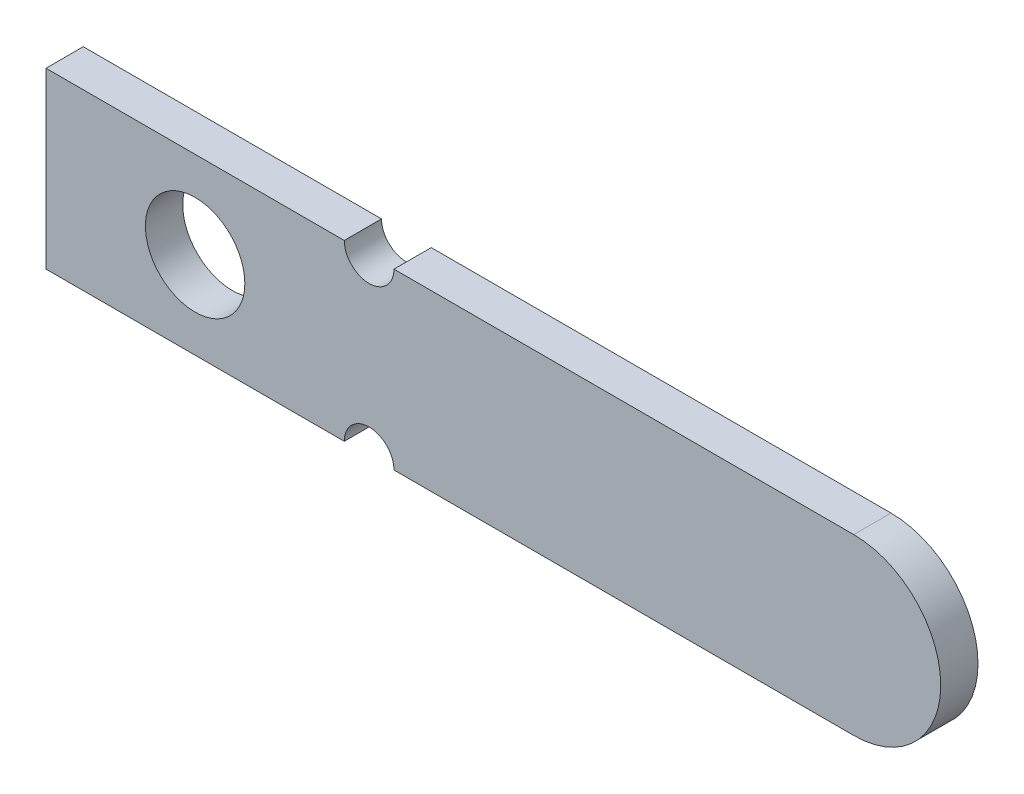
ISO-10303-21;
HEADER;
FILE_DESCRIPTION(('STEP AP214'),'2;1');
FILE_NAME('part.step','',(''),(''),'','','');
FILE_SCHEMA(('AUTOMOTIVE_DESIGN { 1 0 10303 214 1 1 1 1 }'));
ENDSEC;
DATA;
#1=APPLICATION_CONTEXT('core data for automotive mechanical design processes');
#2=APPLICATION_PROTOCOL_DEFINITION('international standard','automotive_design',2000,#1);
#3=PRODUCT_CONTEXT('',#1,'mechanical');
#4=PRODUCT('Part','Part','',(#3));
#5=PRODUCT_RELATED_PRODUCT_CATEGORY('part','',(#4));
#6=PRODUCT_DEFINITION_FORMATION('','',#4);
#7=PRODUCT_DEFINITION_CONTEXT('part definition',#1,'design');
#8=PRODUCT_DEFINITION('design','',#6,#7);
#9=PRODUCT_DEFINITION_SHAPE('','',#8);
#10=(LENGTH_UNIT() NAMED_UNIT(*) SI_UNIT(.MILLI.,.METRE.));
#11=(NAMED_UNIT(*) PLANE_ANGLE_UNIT() SI_UNIT($,.RADIAN.));
#12=(NAMED_UNIT(*) SI_UNIT($,.STERADIAN.) SOLID_ANGLE_UNIT());
#13=UNCERTAINTY_MEASURE_WITH_UNIT(LENGTH_MEASURE(1.E-05),#10,'distance_accuracy_value','');
#14=(GEOMETRIC_REPRESENTATION_CONTEXT(3) GLOBAL_UNCERTAINTY_ASSIGNED_CONTEXT((#13)) GLOBAL_UNIT_ASSIGNED_CONTEXT((#10,
#11,#12)) REPRESENTATION_CONTEXT('',''));
#15=CARTESIAN_POINT('',(0.,0.,0.));
#16=DIRECTION('',(0.,0.,1.));
#17=DIRECTION('',(1.,0.,0.));
#18=AXIS2_PLACEMENT_3D('',#15,#16,#17);
#19=CARTESIAN_POINT('',(16.25,0.,1.5));
#20=DIRECTION('',(0.,0.,1.));
#21=DIRECTION('',(1.,0.,0.));
#22=AXIS2_PLACEMENT_3D('',#19,#20,#21);
#23=PLANE('',#22);
#24=CARTESIAN_POINT('',(16.25,0.,1.5));
#25=DIRECTION('',(0.,0.,1.));
#26=DIRECTION('',(1.,0.,0.));
#27=AXIS2_PLACEMENT_3D('',#24,#25,#26);
#28=CIRCLE('',#27,3.5);
#29=CARTESIAN_POINT('',(16.25,-3.5,1.5));
#30=VERTEX_POINT('',#29);
#31=CARTESIAN_POINT('',(16.25,3.5,1.5));
#32=VERTEX_POINT('',#31);
#33=EDGE_CURVE('E145',#30,#32,#28,.T.);
#34=ORIENTED_EDGE('',*,*,#33,.T.);
#35=DIRECTION('',(-1.,0.,0.));
#36=VECTOR('',#35,1.);
#37=CARTESIAN_POINT('',(-2.24999999999999,3.5,1.5));
#38=LINE('',#37,#36);
#39=CARTESIAN_POINT('',(-2.24999999999999,3.5,1.5));
#40=VERTEX_POINT('',#39);
#41=EDGE_CURVE('E93',#32,#40,#38,.T.);
#42=ORIENTED_EDGE('',*,*,#41,.T.);
#43=CARTESIAN_POINT('',(-3.24999999999999,3.5,1.5));
#44=DIRECTION('',(0.,0.,-1.));
#45=DIRECTION('',(1.,0.,0.));
#46=AXIS2_PLACEMENT_3D('',#43,#44,#45);
#47=CIRCLE('',#46,1.);
#48=CARTESIAN_POINT('',(-4.24999999999999,3.5,1.5));
#49=VERTEX_POINT('',#48);
#50=EDGE_CURVE('E160',#40,#49,#47,.T.);
#51=ORIENTED_EDGE('',*,*,#50,.T.);
#52=DIRECTION('',(-1.,0.,0.));
#53=VECTOR('',#52,1.);
#54=CARTESIAN_POINT('',(-16.25,3.5,1.5));
#55=LINE('',#54,#53);
#56=CARTESIAN_POINT('',(-16.25,3.5,1.5));
#57=VERTEX_POINT('',#56);
#58=EDGE_CURVE('E173',#49,#57,#55,.T.);
#59=ORIENTED_EDGE('',*,*,#58,.T.);
#60=DIRECTION('',(0.,-1.,0.));
#61=VECTOR('',#60,1.);
#62=CARTESIAN_POINT('',(-16.25,3.5,1.5));
#63=LINE('',#62,#61);
#64=CARTESIAN_POINT('',(-16.25,-3.5,1.5));
#65=VERTEX_POINT('',#64);
#66=EDGE_CURVE('E112',#57,#65,#63,.T.);
#67=ORIENTED_EDGE('',*,*,#66,.T.);
#68=DIRECTION('',(1.,0.,0.));
#69=VECTOR('',#68,1.);
#70=CARTESIAN_POINT('',(-16.25,-3.5,1.5));
#71=LINE('',#70,#69);
#72=CARTESIAN_POINT('',(-4.24999999999999,-3.5,1.5));
#73=VERTEX_POINT('',#72);
#74=EDGE_CURVE('E106',#65,#73,#71,.T.);
#75=ORIENTED_EDGE('',*,*,#74,.T.);
#76=CARTESIAN_POINT('',(-3.24999999999999,-3.5,1.5));
#77=DIRECTION('',(0.,0.,-1.));
#78=DIRECTION('',(1.,0.,0.));
#79=AXIS2_PLACEMENT_3D('',#76,#77,#78);
#80=CIRCLE('',#79,1.);
#81=CARTESIAN_POINT('',(-2.24999999999999,-3.5,1.5));
#82=VERTEX_POINT('',#81);
#83=EDGE_CURVE('E110',#73,#82,#80,.T.);
#84=ORIENTED_EDGE('',*,*,#83,.T.);
#85=DIRECTION('',(1.,0.,0.));
#86=VECTOR('',#85,1.);
#87=CARTESIAN_POINT('',(-2.24999999999999,-3.5,1.5));
#88=LINE('',#87,#86);
#89=EDGE_CURVE('E50',#82,#30,#88,.T.);
#90=ORIENTED_EDGE('',*,*,#89,.T.);
#91=EDGE_LOOP('',(#34,#42,#51,#59,#67,#75,#84,#90));
#92=FACE_BOUND('',#91,.T.);
#93=CARTESIAN_POINT('',(-10.25,0.,1.5));
#94=DIRECTION('',(0.,0.,1.));
#95=DIRECTION('',(1.,0.,0.));
#96=AXIS2_PLACEMENT_3D('',#93,#94,#95);
#97=CIRCLE('',#96,2.);
#98=CARTESIAN_POINT('',(-8.24999999999999,0.,1.5));
#99=VERTEX_POINT('',#98);
#100=EDGE_CURVE('E134',#99,#99,#97,.T.);
#101=ORIENTED_EDGE('',*,*,#100,.F.);
#102=EDGE_LOOP('',(#101));
#103=FACE_BOUND('',#102,.T.);
#104=ADVANCED_FACE('F33',(#92,#103),#23,.T.);
#105=CARTESIAN_POINT('',(16.25,0.,0.));
#106=DIRECTION('',(0.,0.,1.));
#107=DIRECTION('',(1.,0.,0.));
#108=AXIS2_PLACEMENT_3D('',#105,#106,#107);
#109=PLANE('',#108);
#110=CARTESIAN_POINT('',(16.25,0.,0.));
#111=DIRECTION('',(0.,0.,1.));
#112=DIRECTION('',(1.,0.,0.));
#113=AXIS2_PLACEMENT_3D('',#110,#111,#112);
#114=CIRCLE('',#113,3.5);
#115=CARTESIAN_POINT('',(16.25,-3.5,0.));
#116=VERTEX_POINT('',#115);
#117=CARTESIAN_POINT('',(16.25,3.5,0.));
#118=VERTEX_POINT('',#117);
#119=EDGE_CURVE('E130',#116,#118,#114,.T.);
#120=ORIENTED_EDGE('',*,*,#119,.F.);
#121=DIRECTION('',(1.,0.,0.));
#122=VECTOR('',#121,1.);
#123=CARTESIAN_POINT('',(-2.24999999999999,-3.5,0.));
#124=LINE('',#123,#122);
#125=CARTESIAN_POINT('',(-2.24999999999999,-3.5,0.));
#126=VERTEX_POINT('',#125);
#127=EDGE_CURVE('E85',#126,#116,#124,.T.);
#128=ORIENTED_EDGE('',*,*,#127,.F.);
#129=CARTESIAN_POINT('',(-3.24999999999999,-3.5,0.));
#130=DIRECTION('',(0.,0.,-1.));
#131=DIRECTION('',(1.,0.,0.));
#132=AXIS2_PLACEMENT_3D('',#129,#130,#131);
#133=CIRCLE('',#132,1.);
#134=CARTESIAN_POINT('',(-4.24999999999999,-3.5,0.));
#135=VERTEX_POINT('',#134);
#136=EDGE_CURVE('E79',#135,#126,#133,.T.);
#137=ORIENTED_EDGE('',*,*,#136,.F.);
#138=DIRECTION('',(1.,0.,0.));
#139=VECTOR('',#138,1.);
#140=CARTESIAN_POINT('',(-16.25,-3.5,0.));
#141=LINE('',#140,#139);
#142=CARTESIAN_POINT('',(-16.25,-3.5,0.));
#143=VERTEX_POINT('',#142);
#144=EDGE_CURVE('E120',#143,#135,#141,.T.);
#145=ORIENTED_EDGE('',*,*,#144,.F.);
#146=DIRECTION('',(0.,-1.,0.));
#147=VECTOR('',#146,1.);
#148=CARTESIAN_POINT('',(-16.25,3.5,0.));
#149=LINE('',#148,#147);
#150=CARTESIAN_POINT('',(-16.25,3.5,0.));
#151=VERTEX_POINT('',#150);
#152=EDGE_CURVE('E140',#151,#143,#149,.T.);
#153=ORIENTED_EDGE('',*,*,#152,.F.);
#154=DIRECTION('',(-1.,0.,0.));
#155=VECTOR('',#154,1.);
#156=CARTESIAN_POINT('',(-16.25,3.5,0.));
#157=LINE('',#156,#155);
#158=CARTESIAN_POINT('',(-4.24999999999999,3.5,0.));
#159=VERTEX_POINT('',#158);
#160=EDGE_CURVE('E138',#159,#151,#157,.T.);
#161=ORIENTED_EDGE('',*,*,#160,.F.);
#162=CARTESIAN_POINT('',(-3.24999999999999,3.5,0.));
#163=DIRECTION('',(0.,0.,-1.));
#164=DIRECTION('',(1.,0.,0.));
#165=AXIS2_PLACEMENT_3D('',#162,#163,#164);
#166=CIRCLE('',#165,1.);
#167=CARTESIAN_POINT('',(-2.24999999999999,3.5,0.));
#168=VERTEX_POINT('',#167);
#169=EDGE_CURVE('E136',#168,#159,#166,.T.);
#170=ORIENTED_EDGE('',*,*,#169,.F.);
#171=DIRECTION('',(-1.,0.,0.));
#172=VECTOR('',#171,1.);
#173=CARTESIAN_POINT('',(-2.24999999999999,3.5,0.));
#174=LINE('',#173,#172);
#175=EDGE_CURVE('E133',#118,#168,#174,.T.);
#176=ORIENTED_EDGE('',*,*,#175,.F.);
#177=EDGE_LOOP('',(#120,#128,#137,#145,#153,#161,#170,#176));
#178=FACE_BOUND('',#177,.T.);
#179=CARTESIAN_POINT('',(-10.25,0.,0.));
#180=DIRECTION('',(0.,0.,1.));
#181=DIRECTION('',(1.,0.,0.));
#182=AXIS2_PLACEMENT_3D('',#179,#180,#181);
#183=CIRCLE('',#182,2.);
#184=CARTESIAN_POINT('',(-8.24999999999999,0.,0.));
#185=VERTEX_POINT('',#184);
#186=EDGE_CURVE('E179',#185,#185,#183,.T.);
#187=ORIENTED_EDGE('',*,*,#186,.T.);
#188=EDGE_LOOP('',(#187));
#189=FACE_BOUND('',#188,.T.);
#190=ADVANCED_FACE('F164',(#178,#189),#109,.F.);
#191=CARTESIAN_POINT('',(16.25,0.,1.5));
#192=DIRECTION('',(0.,0.,-1.));
#193=DIRECTION('',(-1.,0.,0.));
#194=AXIS2_PLACEMENT_3D('',#191,#192,#193);
#195=CYLINDRICAL_SURFACE('',#194,3.5);
#196=ORIENTED_EDGE('',*,*,#119,.T.);
#197=DIRECTION('',(0.,0.,-1.));
#198=VECTOR('',#197,1.);
#199=CARTESIAN_POINT('',(16.25,3.5,1.5));
#200=LINE('',#199,#198);
#201=EDGE_CURVE('E11',#32,#118,#200,.T.);
#202=ORIENTED_EDGE('',*,*,#201,.F.);
#203=ORIENTED_EDGE('',*,*,#33,.F.);
#204=DIRECTION('',(0.,0.,-1.));
#205=VECTOR('',#204,1.);
#206=CARTESIAN_POINT('',(16.25,-3.5,1.5));
#207=LINE('',#206,#205);
#208=EDGE_CURVE('E126',#30,#116,#207,.T.);
#209=ORIENTED_EDGE('',*,*,#208,.T.);
#210=EDGE_LOOP('',(#196,#202,#203,#209));
#211=FACE_BOUND('',#210,.T.);
#212=ADVANCED_FACE('F35',(#211),#195,.T.);
#213=CARTESIAN_POINT('',(-2.24999999999999,3.5,1.5));
#214=DIRECTION('',(0.,-1.,0.));
#215=DIRECTION('',(0.,0.,-1.));
#216=AXIS2_PLACEMENT_3D('',#213,#214,#215);
#217=PLANE('',#216);
#218=ORIENTED_EDGE('',*,*,#175,.T.);
#219=DIRECTION('',(0.,0.,-1.));
#220=VECTOR('',#219,1.);
#221=CARTESIAN_POINT('',(-2.24999999999999,3.5,1.5));
#222=LINE('',#221,#220);
#223=EDGE_CURVE('E42',#40,#168,#222,.T.);
#224=ORIENTED_EDGE('',*,*,#223,.F.);
#225=ORIENTED_EDGE('',*,*,#41,.F.);
#226=ORIENTED_EDGE('',*,*,#201,.T.);
#227=EDGE_LOOP('',(#218,#224,#225,#226));
#228=FACE_BOUND('',#227,.T.);
#229=ADVANCED_FACE('F207',(#228),#217,.F.);
#230=CARTESIAN_POINT('',(-3.24999999999999,3.5,1.5));
#231=DIRECTION('',(0.,0.,-1.));
#232=DIRECTION('',(-1.,0.,0.));
#233=AXIS2_PLACEMENT_3D('',#230,#231,#232);
#234=CYLINDRICAL_SURFACE('',#233,1.);
#235=ORIENTED_EDGE('',*,*,#169,.T.);
#236=DIRECTION('',(0.,0.,-1.));
#237=VECTOR('',#236,1.);
#238=CARTESIAN_POINT('',(-4.24999999999999,3.5,1.5));
#239=LINE('',#238,#237);
#240=EDGE_CURVE('E152',#49,#159,#239,.T.);
#241=ORIENTED_EDGE('',*,*,#240,.F.);
#242=ORIENTED_EDGE('',*,*,#50,.F.);
#243=ORIENTED_EDGE('',*,*,#223,.T.);
#244=EDGE_LOOP('',(#235,#241,#242,#243));
#245=FACE_BOUND('',#244,.T.);
#246=ADVANCED_FACE('F158',(#245),#234,.F.);
#247=CARTESIAN_POINT('',(-16.25,3.5,1.5));
#248=DIRECTION('',(0.,-1.,0.));
#249=DIRECTION('',(0.,0.,-1.));
#250=AXIS2_PLACEMENT_3D('',#247,#248,#249);
#251=PLANE('',#250);
#252=ORIENTED_EDGE('',*,*,#160,.T.);
#253=DIRECTION('',(0.,0.,-1.));
#254=VECTOR('',#253,1.);
#255=CARTESIAN_POINT('',(-16.25,3.5,1.5));
#256=LINE('',#255,#254);
#257=EDGE_CURVE('E149',#57,#151,#256,.T.);
#258=ORIENTED_EDGE('',*,*,#257,.F.);
#259=ORIENTED_EDGE('',*,*,#58,.F.);
#260=ORIENTED_EDGE('',*,*,#240,.T.);
#261=EDGE_LOOP('',(#252,#258,#259,#260));
#262=FACE_BOUND('',#261,.T.);
#263=ADVANCED_FACE('F169',(#262),#251,.F.);
#264=CARTESIAN_POINT('',(-16.25,3.5,1.5));
#265=DIRECTION('',(1.,0.,0.));
#266=DIRECTION('',(0.,0.,-1.));
#267=AXIS2_PLACEMENT_3D('',#264,#265,#266);
#268=PLANE('',#267);
#269=ORIENTED_EDGE('',*,*,#152,.T.);
#270=DIRECTION('',(0.,0.,-1.));
#271=VECTOR('',#270,1.);
#272=CARTESIAN_POINT('',(-16.25,-3.5,1.5));
#273=LINE('',#272,#271);
#274=EDGE_CURVE('E121',#65,#143,#273,.T.);
#275=ORIENTED_EDGE('',*,*,#274,.F.);
#276=ORIENTED_EDGE('',*,*,#66,.F.);
#277=ORIENTED_EDGE('',*,*,#257,.T.);
#278=EDGE_LOOP('',(#269,#275,#276,#277));
#279=FACE_BOUND('',#278,.T.);
#280=ADVANCED_FACE('F172',(#279),#268,.F.);
#281=CARTESIAN_POINT('',(-16.25,-3.5,1.5));
#282=DIRECTION('',(0.,1.,0.));
#283=DIRECTION('',(-1.,0.,0.));
#284=AXIS2_PLACEMENT_3D('',#281,#282,#283);
#285=PLANE('',#284);
#286=ORIENTED_EDGE('',*,*,#144,.T.);
#287=DIRECTION('',(0.,0.,-1.));
#288=VECTOR('',#287,1.);
#289=CARTESIAN_POINT('',(-4.24999999999999,-3.5,1.5));
#290=LINE('',#289,#288);
#291=EDGE_CURVE('E117',#73,#135,#290,.T.);
#292=ORIENTED_EDGE('',*,*,#291,.F.);
#293=ORIENTED_EDGE('',*,*,#74,.F.);
#294=ORIENTED_EDGE('',*,*,#274,.T.);
#295=EDGE_LOOP('',(#286,#292,#293,#294));
#296=FACE_BOUND('',#295,.T.);
#297=ADVANCED_FACE('F118',(#296),#285,.F.);
#298=CARTESIAN_POINT('',(-3.24999999999999,-3.5,1.5));
#299=DIRECTION('',(0.,0.,-1.));
#300=DIRECTION('',(-1.,0.,0.));
#301=AXIS2_PLACEMENT_3D('',#298,#299,#300);
#302=CYLINDRICAL_SURFACE('',#301,1.);
#303=ORIENTED_EDGE('',*,*,#136,.T.);
#304=DIRECTION('',(0.,0.,-1.));
#305=VECTOR('',#304,1.);
#306=CARTESIAN_POINT('',(-2.24999999999999,-3.5,1.5));
#307=LINE('',#306,#305);
#308=EDGE_CURVE('E122',#82,#126,#307,.T.);
#309=ORIENTED_EDGE('',*,*,#308,.F.);
#310=ORIENTED_EDGE('',*,*,#83,.F.);
#311=ORIENTED_EDGE('',*,*,#291,.T.);
#312=EDGE_LOOP('',(#303,#309,#310,#311));
#313=FACE_BOUND('',#312,.T.);
#314=ADVANCED_FACE('F124',(#313),#302,.F.);
#315=CARTESIAN_POINT('',(-2.24999999999999,-3.5,1.5));
#316=DIRECTION('',(0.,1.,0.));
#317=DIRECTION('',(0.,0.,1.));
#318=AXIS2_PLACEMENT_3D('',#315,#316,#317);
#319=PLANE('',#318);
#320=ORIENTED_EDGE('',*,*,#127,.T.);
#321=ORIENTED_EDGE('',*,*,#208,.F.);
#322=ORIENTED_EDGE('',*,*,#89,.F.);
#323=ORIENTED_EDGE('',*,*,#308,.T.);
#324=EDGE_LOOP('',(#320,#321,#322,#323));
#325=FACE_BOUND('',#324,.T.);
#326=ADVANCED_FACE('F195',(#325),#319,.F.);
#327=CARTESIAN_POINT('',(-10.25,0.,1.5));
#328=DIRECTION('',(0.,0.,-1.));
#329=DIRECTION('',(-1.,0.,0.));
#330=AXIS2_PLACEMENT_3D('',#327,#328,#329);
#331=CYLINDRICAL_SURFACE('',#330,2.);
#332=ORIENTED_EDGE('',*,*,#100,.T.);
#333=EDGE_LOOP('',(#332));
#334=FACE_BOUND('',#333,.T.);
#335=ORIENTED_EDGE('',*,*,#186,.F.);
#336=EDGE_LOOP('',(#335));
#337=FACE_BOUND('',#336,.T.);
#338=ADVANCED_FACE('F185',(#334,#337),#331,.F.);
#339=CLOSED_SHELL('',(#104,#190,#212,#229,#246,#263,#280,#297,#314,#326,#338));
#340=MANIFOLD_SOLID_BREP('B2',#339);
#341=ADVANCED_BREP_SHAPE_REPRESENTATION('',(#18,#340),#14);
#342=SHAPE_DEFINITION_REPRESENTATION(#9,#341);
ENDSEC;
END-ISO-10303-21;
